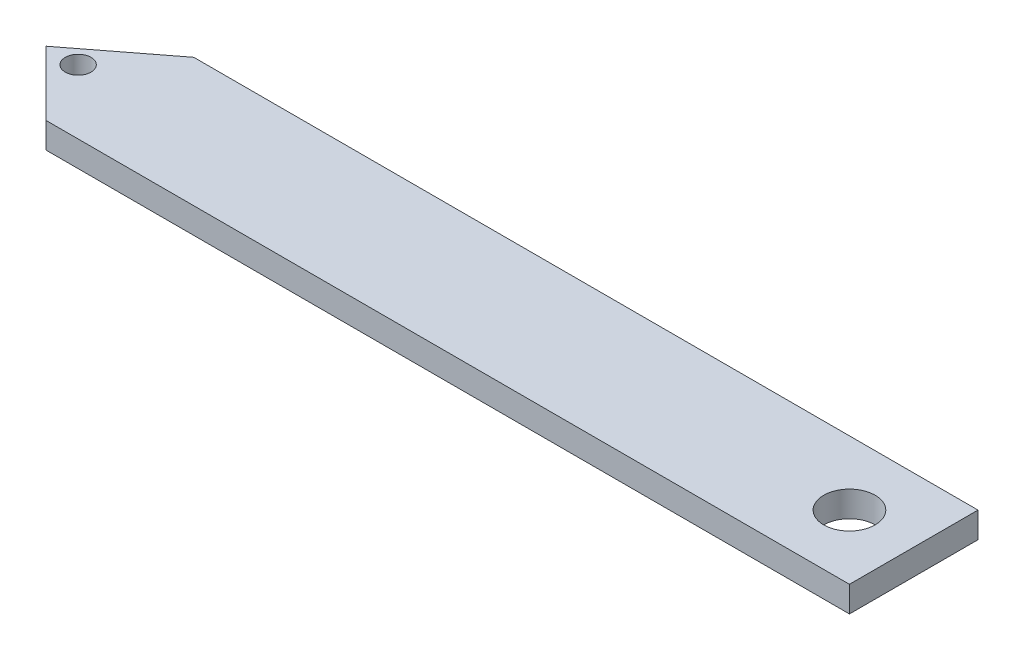
ISO-10303-21;
HEADER;
FILE_DESCRIPTION(('STEP AP214'),'2;1');
FILE_NAME('part.step','',(''),(''),'','','');
FILE_SCHEMA(('AUTOMOTIVE_DESIGN { 1 0 10303 214 1 1 1 1 }'));
ENDSEC;
DATA;
#1=APPLICATION_CONTEXT('core data for automotive mechanical design processes');
#2=APPLICATION_PROTOCOL_DEFINITION('international standard','automotive_design',2000,#1);
#3=PRODUCT_CONTEXT('',#1,'mechanical');
#4=PRODUCT('Part','Part','',(#3));
#5=PRODUCT_RELATED_PRODUCT_CATEGORY('part','',(#4));
#6=PRODUCT_DEFINITION_FORMATION('','',#4);
#7=PRODUCT_DEFINITION_CONTEXT('part definition',#1,'design');
#8=PRODUCT_DEFINITION('design','',#6,#7);
#9=PRODUCT_DEFINITION_SHAPE('','',#8);
#10=(LENGTH_UNIT() NAMED_UNIT(*) SI_UNIT(.MILLI.,.METRE.));
#11=(NAMED_UNIT(*) PLANE_ANGLE_UNIT() SI_UNIT($,.RADIAN.));
#12=(NAMED_UNIT(*) SI_UNIT($,.STERADIAN.) SOLID_ANGLE_UNIT());
#13=UNCERTAINTY_MEASURE_WITH_UNIT(LENGTH_MEASURE(1.E-05),#10,'distance_accuracy_value','');
#14=(GEOMETRIC_REPRESENTATION_CONTEXT(3) GLOBAL_UNCERTAINTY_ASSIGNED_CONTEXT((#13)) GLOBAL_UNIT_ASSIGNED_CONTEXT((#10,
#11,#12)) REPRESENTATION_CONTEXT('',''));
#15=CARTESIAN_POINT('',(0.,0.,0.));
#16=DIRECTION('',(0.,0.,1.));
#17=DIRECTION('',(1.,0.,0.));
#18=AXIS2_PLACEMENT_3D('',#15,#16,#17);
#19=CARTESIAN_POINT('',(0.,2.,0.));
#20=DIRECTION('',(0.,1.,0.));
#21=DIRECTION('',(0.,0.,1.));
#22=AXIS2_PLACEMENT_3D('',#19,#20,#21);
#23=PLANE('',#22);
#24=CARTESIAN_POINT('',(-23.7049519395466,2.,-0.629386767419579));
#25=DIRECTION('',(0.,1.,0.));
#26=DIRECTION('',(0.,0.,1.));
#27=AXIS2_PLACEMENT_3D('',#24,#25,#26);
#28=CIRCLE('',#27,1.);
#29=CARTESIAN_POINT('',(-23.7049519395466,2.,0.370613232580423));
#30=VERTEX_POINT('',#29);
#31=EDGE_CURVE('E116',#30,#30,#28,.T.);
#32=ORIENTED_EDGE('',*,*,#31,.F.);
#33=EDGE_LOOP('',(#32));
#34=FACE_BOUND('',#33,.T.);
#35=CARTESIAN_POINT('',(36.2950480604534,2.,-0.629386767419579));
#36=DIRECTION('',(0.,1.,0.));
#37=DIRECTION('',(0.,0.,1.));
#38=AXIS2_PLACEMENT_3D('',#35,#36,#37);
#39=CIRCLE('',#38,2.);
#40=CARTESIAN_POINT('',(36.2950480604534,2.,1.37061323258042));
#41=VERTEX_POINT('',#40);
#42=EDGE_CURVE('E119',#41,#41,#39,.T.);
#43=ORIENTED_EDGE('',*,*,#42,.F.);
#44=EDGE_LOOP('',(#43));
#45=FACE_BOUND('',#44,.T.);
#46=DIRECTION('',(0.792453278420542,0.,-0.609932620475849));
#47=VECTOR('',#46,1.);
#48=CARTESIAN_POINT('',(-10.0529183637305,2.,-13.0612265151799));
#49=LINE('',#48,#47);
#50=CARTESIAN_POINT('',(-26.2049519395467,2.,-0.62938676741958));
#51=VERTEX_POINT('',#50);
#52=CARTESIAN_POINT('',(-19.7087157011708,2.,-5.62938676741958));
#53=VERTEX_POINT('',#52);
#54=EDGE_CURVE('E12',#51,#53,#49,.T.);
#55=ORIENTED_EDGE('',*,*,#54,.F.);
#56=DIRECTION('',(0.707106781186554,0.,0.707106781186542));
#57=VECTOR('',#56,1.);
#58=CARTESIAN_POINT('',(-12.7877825860633,2.,12.7877825860635));
#59=LINE('',#58,#57);
#60=CARTESIAN_POINT('',(-21.2049519395467,2.,4.37061323258042));
#61=VERTEX_POINT('',#60);
#62=EDGE_CURVE('E87',#51,#61,#59,.T.);
#63=ORIENTED_EDGE('',*,*,#62,.T.);
#64=DIRECTION('',(1.,0.,0.));
#65=VECTOR('',#64,1.);
#66=CARTESIAN_POINT('',(-26.2049519395467,2.,4.37061323258042));
#67=LINE('',#66,#65);
#68=CARTESIAN_POINT('',(41.2950480604534,2.,4.37061323258042));
#69=VERTEX_POINT('',#68);
#70=EDGE_CURVE('E97',#61,#69,#67,.T.);
#71=ORIENTED_EDGE('',*,*,#70,.T.);
#72=DIRECTION('',(0.,0.,-1.));
#73=VECTOR('',#72,1.);
#74=CARTESIAN_POINT('',(41.2950480604534,2.,-5.62938676741958));
#75=LINE('',#74,#73);
#76=CARTESIAN_POINT('',(41.2950480604534,2.,-5.62938676741958));
#77=VERTEX_POINT('',#76);
#78=EDGE_CURVE('E105',#69,#77,#75,.T.);
#79=ORIENTED_EDGE('',*,*,#78,.T.);
#80=DIRECTION('',(-1.,0.,0.));
#81=VECTOR('',#80,1.);
#82=CARTESIAN_POINT('',(-26.2049519395467,2.,-5.62938676741958));
#83=LINE('',#82,#81);
#84=EDGE_CURVE('E107',#77,#53,#83,.T.);
#85=ORIENTED_EDGE('',*,*,#84,.T.);
#86=EDGE_LOOP('',(#55,#63,#71,#79,#85));
#87=FACE_BOUND('',#86,.T.);
#88=ADVANCED_FACE('F42',(#34,#45,#87),#23,.T.);
#89=CARTESIAN_POINT('',(0.,0.,0.));
#90=DIRECTION('',(0.,1.,0.));
#91=DIRECTION('',(0.,0.,1.));
#92=AXIS2_PLACEMENT_3D('',#89,#90,#91);
#93=PLANE('',#92);
#94=CARTESIAN_POINT('',(-23.7049519395466,0.,-0.629386767419579));
#95=DIRECTION('',(0.,1.,0.));
#96=DIRECTION('',(0.,0.,1.));
#97=AXIS2_PLACEMENT_3D('',#94,#95,#96);
#98=CIRCLE('',#97,1.);
#99=CARTESIAN_POINT('',(-23.7049519395466,0.,0.370613232580423));
#100=VERTEX_POINT('',#99);
#101=EDGE_CURVE('E112',#100,#100,#98,.T.);
#102=ORIENTED_EDGE('',*,*,#101,.T.);
#103=EDGE_LOOP('',(#102));
#104=FACE_BOUND('',#103,.T.);
#105=CARTESIAN_POINT('',(36.2950480604534,0.,-0.629386767419579));
#106=DIRECTION('',(0.,1.,0.));
#107=DIRECTION('',(0.,0.,1.));
#108=AXIS2_PLACEMENT_3D('',#105,#106,#107);
#109=CIRCLE('',#108,2.);
#110=CARTESIAN_POINT('',(36.2950480604534,0.,1.37061323258042));
#111=VERTEX_POINT('',#110);
#112=EDGE_CURVE('E115',#111,#111,#109,.T.);
#113=ORIENTED_EDGE('',*,*,#112,.T.);
#114=EDGE_LOOP('',(#113));
#115=FACE_BOUND('',#114,.T.);
#116=DIRECTION('',(0.707106781186554,0.,0.707106781186542));
#117=VECTOR('',#116,1.);
#118=CARTESIAN_POINT('',(-12.7877825860633,0.,12.7877825860636));
#119=LINE('',#118,#117);
#120=CARTESIAN_POINT('',(-26.2049519395467,0.,-0.62938676741958));
#121=VERTEX_POINT('',#120);
#122=CARTESIAN_POINT('',(-21.2049519395467,0.,4.37061323258042));
#123=VERTEX_POINT('',#122);
#124=EDGE_CURVE('E89',#121,#123,#119,.T.);
#125=ORIENTED_EDGE('',*,*,#124,.F.);
#126=DIRECTION('',(0.792453278420542,0.,-0.609932620475849));
#127=VECTOR('',#126,1.);
#128=CARTESIAN_POINT('',(-10.0529183637305,0.,-13.0612265151799));
#129=LINE('',#128,#127);
#130=CARTESIAN_POINT('',(-19.7087157011708,0.,-5.62938676741958));
#131=VERTEX_POINT('',#130);
#132=EDGE_CURVE('E56',#121,#131,#129,.T.);
#133=ORIENTED_EDGE('',*,*,#132,.T.);
#134=DIRECTION('',(-1.,0.,0.));
#135=VECTOR('',#134,1.);
#136=CARTESIAN_POINT('',(-26.2049519395467,0.,-5.62938676741958));
#137=LINE('',#136,#135);
#138=CARTESIAN_POINT('',(41.2950480604534,0.,-5.62938676741958));
#139=VERTEX_POINT('',#138);
#140=EDGE_CURVE('E128',#139,#131,#137,.T.);
#141=ORIENTED_EDGE('',*,*,#140,.F.);
#142=DIRECTION('',(0.,0.,-1.));
#143=VECTOR('',#142,1.);
#144=CARTESIAN_POINT('',(41.2950480604534,0.,-5.62938676741958));
#145=LINE('',#144,#143);
#146=CARTESIAN_POINT('',(41.2950480604534,0.,4.37061323258042));
#147=VERTEX_POINT('',#146);
#148=EDGE_CURVE('E135',#147,#139,#145,.T.);
#149=ORIENTED_EDGE('',*,*,#148,.F.);
#150=DIRECTION('',(1.,0.,0.));
#151=VECTOR('',#150,1.);
#152=CARTESIAN_POINT('',(-26.2049519395467,0.,4.37061323258042));
#153=LINE('',#152,#151);
#154=EDGE_CURVE('E93',#123,#147,#153,.T.);
#155=ORIENTED_EDGE('',*,*,#154,.F.);
#156=EDGE_LOOP('',(#125,#133,#141,#149,#155));
#157=FACE_BOUND('',#156,.T.);
#158=ADVANCED_FACE('F143',(#104,#115,#157),#93,.F.);
#159=CARTESIAN_POINT('',(-26.2049519395467,2.,4.37061323258042));
#160=DIRECTION('',(0.,0.,-1.));
#161=DIRECTION('',(-1.,0.,0.));
#162=AXIS2_PLACEMENT_3D('',#159,#160,#161);
#163=PLANE('',#162);
#164=ORIENTED_EDGE('',*,*,#70,.F.);
#165=DIRECTION('',(0.,-1.,0.));
#166=VECTOR('',#165,1.);
#167=CARTESIAN_POINT('',(-21.2049519395467,2.,4.37061323258042));
#168=LINE('',#167,#166);
#169=EDGE_CURVE('E84',#61,#123,#168,.T.);
#170=ORIENTED_EDGE('',*,*,#169,.T.);
#171=ORIENTED_EDGE('',*,*,#154,.T.);
#172=DIRECTION('',(0.,-1.,0.));
#173=VECTOR('',#172,1.);
#174=CARTESIAN_POINT('',(41.2950480604534,2.,4.37061323258042));
#175=LINE('',#174,#173);
#176=EDGE_CURVE('E103',#69,#147,#175,.T.);
#177=ORIENTED_EDGE('',*,*,#176,.F.);
#178=EDGE_LOOP('',(#164,#170,#171,#177));
#179=FACE_BOUND('',#178,.T.);
#180=ADVANCED_FACE('F101',(#179),#163,.F.);
#181=CARTESIAN_POINT('',(41.2950480604534,2.,-5.62938676741958));
#182=DIRECTION('',(-1.,0.,0.));
#183=DIRECTION('',(0.,0.,1.));
#184=AXIS2_PLACEMENT_3D('',#181,#182,#183);
#185=PLANE('',#184);
#186=ORIENTED_EDGE('',*,*,#148,.T.);
#187=DIRECTION('',(0.,-1.,0.));
#188=VECTOR('',#187,1.);
#189=CARTESIAN_POINT('',(41.2950480604534,2.,-5.62938676741958));
#190=LINE('',#189,#188);
#191=EDGE_CURVE('E120',#77,#139,#190,.T.);
#192=ORIENTED_EDGE('',*,*,#191,.F.);
#193=ORIENTED_EDGE('',*,*,#78,.F.);
#194=ORIENTED_EDGE('',*,*,#176,.T.);
#195=EDGE_LOOP('',(#186,#192,#193,#194));
#196=FACE_BOUND('',#195,.T.);
#197=ADVANCED_FACE('F144',(#196),#185,.F.);
#198=CARTESIAN_POINT('',(-26.2049519395467,2.,-5.62938676741958));
#199=DIRECTION('',(0.,0.,1.));
#200=DIRECTION('',(1.,0.,0.));
#201=AXIS2_PLACEMENT_3D('',#198,#199,#200);
#202=PLANE('',#201);
#203=ORIENTED_EDGE('',*,*,#140,.T.);
#204=DIRECTION('',(0.,1.,0.));
#205=VECTOR('',#204,1.);
#206=CARTESIAN_POINT('',(-19.7087157011708,-3.,-5.62938676741958));
#207=LINE('',#206,#205);
#208=EDGE_CURVE('E126',#131,#53,#207,.T.);
#209=ORIENTED_EDGE('',*,*,#208,.T.);
#210=ORIENTED_EDGE('',*,*,#84,.F.);
#211=ORIENTED_EDGE('',*,*,#191,.T.);
#212=EDGE_LOOP('',(#203,#209,#210,#211));
#213=FACE_BOUND('',#212,.T.);
#214=ADVANCED_FACE('F140',(#213),#202,.F.);
#215=CARTESIAN_POINT('',(-23.7049519395466,2.,-0.629386767419579));
#216=DIRECTION('',(0.,-1.,0.));
#217=DIRECTION('',(0.,0.,-1.));
#218=AXIS2_PLACEMENT_3D('',#215,#216,#217);
#219=CYLINDRICAL_SURFACE('',#218,1.);
#220=ORIENTED_EDGE('',*,*,#31,.T.);
#221=EDGE_LOOP('',(#220));
#222=FACE_BOUND('',#221,.T.);
#223=ORIENTED_EDGE('',*,*,#101,.F.);
#224=EDGE_LOOP('',(#223));
#225=FACE_BOUND('',#224,.T.);
#226=ADVANCED_FACE('F151',(#222,#225),#219,.F.);
#227=CARTESIAN_POINT('',(36.2950480604534,2.,-0.629386767419579));
#228=DIRECTION('',(0.,-1.,0.));
#229=DIRECTION('',(0.,0.,-1.));
#230=AXIS2_PLACEMENT_3D('',#227,#228,#229);
#231=CYLINDRICAL_SURFACE('',#230,2.);
#232=ORIENTED_EDGE('',*,*,#42,.T.);
#233=EDGE_LOOP('',(#232));
#234=FACE_BOUND('',#233,.T.);
#235=ORIENTED_EDGE('',*,*,#112,.F.);
#236=EDGE_LOOP('',(#235));
#237=FACE_BOUND('',#236,.T.);
#238=ADVANCED_FACE('F164',(#234,#237),#231,.F.);
#239=CARTESIAN_POINT('',(-10.0529183637305,-3.,-13.0612265151799));
#240=DIRECTION('',(0.609932620475849,0.,0.792453278420542));
#241=DIRECTION('',(0.792453278420542,0.,-0.609932620475849));
#242=AXIS2_PLACEMENT_3D('',#239,#240,#241);
#243=PLANE('',#242);
#244=ORIENTED_EDGE('',*,*,#208,.F.);
#245=ORIENTED_EDGE('',*,*,#132,.F.);
#246=DIRECTION('',(0.,-1.,0.));
#247=VECTOR('',#246,1.);
#248=CARTESIAN_POINT('',(-26.2049519395467,2.,-0.629386767419579));
#249=LINE('',#248,#247);
#250=EDGE_CURVE('E45',#121,#51,#249,.F.);
#251=ORIENTED_EDGE('',*,*,#250,.T.);
#252=ORIENTED_EDGE('',*,*,#54,.T.);
#253=EDGE_LOOP('',(#244,#245,#251,#252));
#254=FACE_BOUND('',#253,.T.);
#255=ADVANCED_FACE('F167',(#254),#243,.F.);
#256=CARTESIAN_POINT('',(-12.7877825860633,-3.,12.7877825860635));
#257=DIRECTION('',(-0.707106781186542,0.,0.707106781186554));
#258=DIRECTION('',(0.707106781186554,0.,0.707106781186542));
#259=AXIS2_PLACEMENT_3D('',#256,#257,#258);
#260=PLANE('',#259);
#261=ORIENTED_EDGE('',*,*,#124,.T.);
#262=ORIENTED_EDGE('',*,*,#169,.F.);
#263=ORIENTED_EDGE('',*,*,#62,.F.);
#264=ORIENTED_EDGE('',*,*,#250,.F.);
#265=EDGE_LOOP('',(#261,#262,#263,#264));
#266=FACE_BOUND('',#265,.T.);
#267=ADVANCED_FACE('F86',(#266),#260,.T.);
#268=CLOSED_SHELL('',(#88,#158,#180,#197,#214,#226,#238,#255,#267));
#269=MANIFOLD_SOLID_BREP('B2',#268);
#270=CARTESIAN_POINT('',(-21.2049519395467,2.,-0.62938676741958));
#271=DIRECTION('',(0.,-1.,0.));
#272=DIRECTION('',(0.,0.,-1.));
#273=AXIS2_PLACEMENT_3D('',#270,#271,#272);
#274=CYLINDRICAL_SURFACE('',#273,5.);
#275=DIRECTION('',(0.,1.,0.));
#276=VECTOR('',#275,1.);
#277=CARTESIAN_POINT('',(-26.2049051556126,-0.5,-0.651016310906118));
#278=LINE('',#277,#276);
#279=CARTESIAN_POINT('',(-26.2049051556126,0.,-0.651016310906117));
#280=VERTEX_POINT('',#279);
#281=CARTESIAN_POINT('',(-26.2049051556126,2.,-0.651016310906118));
#282=VERTEX_POINT('',#281);
#283=EDGE_CURVE('E266',#280,#282,#278,.T.);
#284=ORIENTED_EDGE('',*,*,#283,.F.);
#285=CARTESIAN_POINT('',(-21.2049519395467,0.,-0.62938676741958));
#286=DIRECTION('',(0.,1.,0.));
#287=DIRECTION('',(0.,0.,1.));
#288=AXIS2_PLACEMENT_3D('',#285,#286,#287);
#289=CIRCLE('',#288,5.);
#290=CARTESIAN_POINT('',(-26.2049519395467,0.,-0.62938676741958));
#291=VERTEX_POINT('',#290);
#292=EDGE_CURVE('E281',#291,#280,#289,.F.);
#293=ORIENTED_EDGE('',*,*,#292,.F.);
#294=DIRECTION('',(0.,-1.,0.));
#295=VECTOR('',#294,1.);
#296=CARTESIAN_POINT('',(-26.2049519395467,2.,-0.629386767419579));
#297=LINE('',#296,#295);
#298=CARTESIAN_POINT('',(-26.2049519395467,2.,-0.629386767419579));
#299=VERTEX_POINT('',#298);
#300=EDGE_CURVE('E240',#291,#299,#297,.F.);
#301=ORIENTED_EDGE('',*,*,#300,.T.);
#302=CARTESIAN_POINT('',(-21.2049519395467,2.,-0.62938676741958));
#303=DIRECTION('',(0.,1.,0.));
#304=DIRECTION('',(0.,0.,1.));
#305=AXIS2_PLACEMENT_3D('',#302,#303,#304);
#306=CIRCLE('',#305,5.);
#307=EDGE_CURVE('E277',#282,#299,#306,.T.);
#308=ORIENTED_EDGE('',*,*,#307,.F.);
#309=EDGE_LOOP('',(#284,#293,#301,#308));
#310=FACE_BOUND('',#309,.T.);
#311=ADVANCED_FACE('F233',(#310),#274,.T.);
#312=CARTESIAN_POINT('',(0.,0.,0.));
#313=DIRECTION('',(0.,1.,0.));
#314=DIRECTION('',(0.,0.,1.));
#315=AXIS2_PLACEMENT_3D('',#312,#313,#314);
#316=PLANE('',#315);
#317=ORIENTED_EDGE('',*,*,#292,.T.);
#318=CARTESIAN_POINT('',(-28.2888281489022,0.,-3.95751909924513));
#319=DIRECTION('',(0.,1.,0.));
#320=DIRECTION('',(0.,0.,1.));
#321=AXIS2_PLACEMENT_3D('',#318,#319,#320);
#322=CIRCLE('',#321,3.90841345449207);
#323=CARTESIAN_POINT('',(-26.2007796843246,0.,-0.653619987463746));
#324=VERTEX_POINT('',#323);
#325=EDGE_CURVE('E268',#280,#324,#322,.T.);
#326=ORIENTED_EDGE('',*,*,#325,.T.);
#327=DIRECTION('',(-0.169674447567036,0.,0.985500168362655));
#328=VECTOR('',#327,1.);
#329=CARTESIAN_POINT('',(-25.5557690230628,0.,-4.39995966549982));
#330=LINE('',#329,#328);
#331=EDGE_CURVE('E254',#324,#291,#330,.T.);
#332=ORIENTED_EDGE('',*,*,#331,.T.);
#333=EDGE_LOOP('',(#317,#326,#332));
#334=FACE_BOUND('',#333,.T.);
#335=ADVANCED_FACE('F287',(#334),#316,.F.);
#336=CARTESIAN_POINT('',(0.,2.,0.));
#337=DIRECTION('',(0.,1.,0.));
#338=DIRECTION('',(0.,0.,1.));
#339=AXIS2_PLACEMENT_3D('',#336,#337,#338);
#340=PLANE('',#339);
#341=CARTESIAN_POINT('',(-28.2888281489022,2.,-3.95751909924513));
#342=DIRECTION('',(0.,1.,0.));
#343=DIRECTION('',(0.,0.,1.));
#344=AXIS2_PLACEMENT_3D('',#341,#342,#343);
#345=CIRCLE('',#344,3.90841345449207);
#346=CARTESIAN_POINT('',(-26.2007796843246,2.,-0.653619987463746));
#347=VERTEX_POINT('',#346);
#348=EDGE_CURVE('E247',#282,#347,#345,.T.);
#349=ORIENTED_EDGE('',*,*,#348,.F.);
#350=ORIENTED_EDGE('',*,*,#307,.T.);
#351=DIRECTION('',(-0.169674447567036,0.,0.985500168362655));
#352=VECTOR('',#351,1.);
#353=CARTESIAN_POINT('',(-25.5557690230628,2.,-4.39995966549982));
#354=LINE('',#353,#352);
#355=EDGE_CURVE('E272',#347,#299,#354,.T.);
#356=ORIENTED_EDGE('',*,*,#355,.F.);
#357=EDGE_LOOP('',(#349,#350,#356));
#358=FACE_BOUND('',#357,.T.);
#359=ADVANCED_FACE('F276',(#358),#340,.T.);
#360=CARTESIAN_POINT('',(-25.5557690230628,-3.,-4.39995966549982));
#361=DIRECTION('',(-0.985500168362655,0.,-0.169674447567036));
#362=DIRECTION('',(-0.169674447567036,0.,0.985500168362655));
#363=AXIS2_PLACEMENT_3D('',#360,#361,#362);
#364=PLANE('',#363);
#365=ORIENTED_EDGE('',*,*,#331,.F.);
#366=DIRECTION('',(0.,1.,0.));
#367=VECTOR('',#366,1.);
#368=CARTESIAN_POINT('',(-26.2007796843246,-3.,-0.653619987463746));
#369=LINE('',#368,#367);
#370=EDGE_CURVE('E40',#324,#347,#369,.T.);
#371=ORIENTED_EDGE('',*,*,#370,.T.);
#372=ORIENTED_EDGE('',*,*,#355,.T.);
#373=ORIENTED_EDGE('',*,*,#300,.F.);
#374=EDGE_LOOP('',(#365,#371,#372,#373));
#375=FACE_BOUND('',#374,.T.);
#376=ADVANCED_FACE('F289',(#375),#364,.F.);
#377=CARTESIAN_POINT('',(-28.2888281489022,-3.,-3.95751909924513));
#378=DIRECTION('',(0.,1.,0.));
#379=DIRECTION('',(0.,0.,1.));
#380=AXIS2_PLACEMENT_3D('',#377,#378,#379);
#381=CYLINDRICAL_SURFACE('',#380,3.90841345449207);
#382=ORIENTED_EDGE('',*,*,#283,.T.);
#383=ORIENTED_EDGE('',*,*,#348,.T.);
#384=ORIENTED_EDGE('',*,*,#370,.F.);
#385=ORIENTED_EDGE('',*,*,#325,.F.);
#386=EDGE_LOOP('',(#382,#383,#384,#385));
#387=FACE_BOUND('',#386,.T.);
#388=ADVANCED_FACE('F267',(#387),#381,.F.);
#389=CLOSED_SHELL('',(#311,#335,#359,#376,#388));
#390=MANIFOLD_SOLID_BREP('B6',#389);
#391=ADVANCED_BREP_SHAPE_REPRESENTATION('',(#18,#269,#390),#14);
#392=SHAPE_DEFINITION_REPRESENTATION(#9,#391);
ENDSEC;
END-ISO-10303-21;
